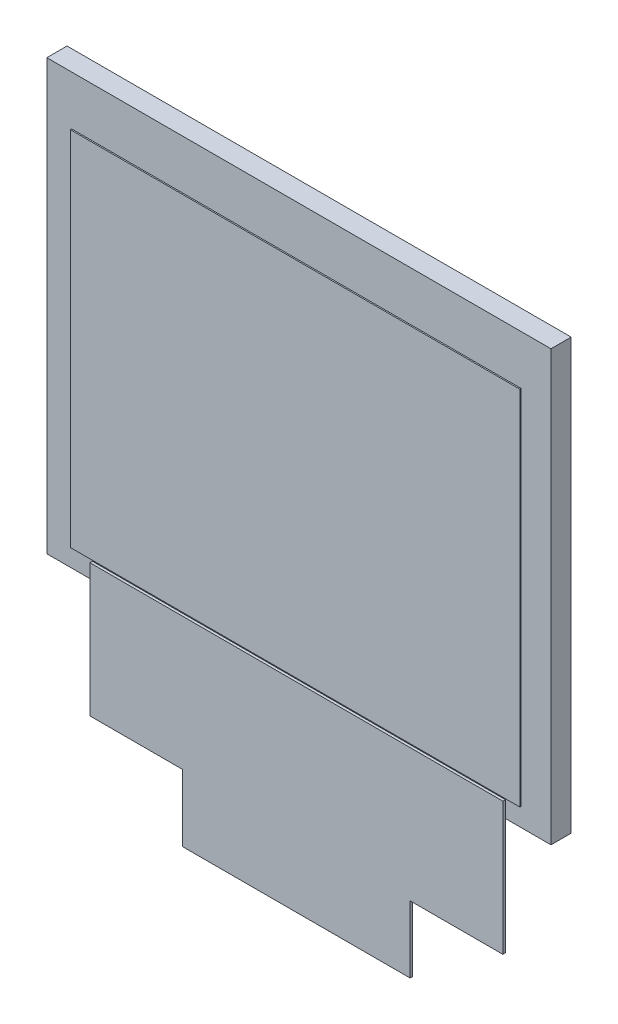
ISO-10303-21;
HEADER;
FILE_DESCRIPTION(('STEP AP214'),'2;1');
FILE_NAME('part.step','',(''),(''),'','','');
FILE_SCHEMA(('AUTOMOTIVE_DESIGN { 1 0 10303 214 1 1 1 1 }'));
ENDSEC;
DATA;
#1=APPLICATION_CONTEXT('core data for automotive mechanical design processes');
#2=APPLICATION_PROTOCOL_DEFINITION('international standard','automotive_design',2000,#1);
#3=PRODUCT_CONTEXT('',#1,'mechanical');
#4=PRODUCT('Part','Part','',(#3));
#5=PRODUCT_RELATED_PRODUCT_CATEGORY('part','',(#4));
#6=PRODUCT_DEFINITION_FORMATION('','',#4);
#7=PRODUCT_DEFINITION_CONTEXT('part definition',#1,'design');
#8=PRODUCT_DEFINITION('design','',#6,#7);
#9=PRODUCT_DEFINITION_SHAPE('','',#8);
#10=(LENGTH_UNIT() NAMED_UNIT(*) SI_UNIT(.MILLI.,.METRE.));
#11=(NAMED_UNIT(*) PLANE_ANGLE_UNIT() SI_UNIT($,.RADIAN.));
#12=(NAMED_UNIT(*) SI_UNIT($,.STERADIAN.) SOLID_ANGLE_UNIT());
#13=UNCERTAINTY_MEASURE_WITH_UNIT(LENGTH_MEASURE(1.E-05),#10,'distance_accuracy_value','');
#14=(GEOMETRIC_REPRESENTATION_CONTEXT(3) GLOBAL_UNCERTAINTY_ASSIGNED_CONTEXT((#13)) GLOBAL_UNIT_ASSIGNED_CONTEXT((#10,
#11,#12)) REPRESENTATION_CONTEXT('',''));
#15=CARTESIAN_POINT('',(0.,0.,0.));
#16=DIRECTION('',(0.,0.,1.));
#17=DIRECTION('',(1.,0.,0.));
#18=AXIS2_PLACEMENT_3D('',#15,#16,#17);
#19=CARTESIAN_POINT('',(-17.7875,13.3,1.9));
#20=DIRECTION('',(1.,0.,0.));
#21=DIRECTION('',(0.,1.,0.));
#22=AXIS2_PLACEMENT_3D('',#19,#20,#21);
#23=PLANE('',#22);
#24=DIRECTION('',(0.,-1.,0.));
#25=VECTOR('',#24,1.);
#26=CARTESIAN_POINT('',(-17.7875,13.3,1.8));
#27=LINE('',#26,#25);
#28=CARTESIAN_POINT('',(-17.7875,13.3,1.8));
#29=VERTEX_POINT('',#28);
#30=CARTESIAN_POINT('',(-17.7875,-15.34,1.8));
#31=VERTEX_POINT('',#30);
#32=EDGE_CURVE('E107',#29,#31,#27,.T.);
#33=ORIENTED_EDGE('',*,*,#32,.T.);
#34=DIRECTION('',(0.,0.,-1.));
#35=VECTOR('',#34,1.);
#36=CARTESIAN_POINT('',(-17.7875,-15.34,1.9));
#37=LINE('',#36,#35);
#38=CARTESIAN_POINT('',(-17.7875,-15.34,1.9));
#39=VERTEX_POINT('',#38);
#40=EDGE_CURVE('E12',#39,#31,#37,.T.);
#41=ORIENTED_EDGE('',*,*,#40,.F.);
#42=DIRECTION('',(0.,-1.,0.));
#43=VECTOR('',#42,1.);
#44=CARTESIAN_POINT('',(-17.7875,13.3,1.9));
#45=LINE('',#44,#43);
#46=CARTESIAN_POINT('',(-17.7875,13.3,1.9));
#47=VERTEX_POINT('',#46);
#48=EDGE_CURVE('E95',#47,#39,#45,.T.);
#49=ORIENTED_EDGE('',*,*,#48,.F.);
#50=DIRECTION('',(0.,0.,-1.));
#51=VECTOR('',#50,1.);
#52=CARTESIAN_POINT('',(-17.7875,13.3,1.9));
#53=LINE('',#52,#51);
#54=EDGE_CURVE('E103',#47,#29,#53,.T.);
#55=ORIENTED_EDGE('',*,*,#54,.T.);
#56=EDGE_LOOP('',(#33,#41,#49,#55));
#57=FACE_BOUND('',#56,.T.);
#58=ADVANCED_FACE('F44',(#57),#23,.F.);
#59=CARTESIAN_POINT('',(-17.7875,-15.34,1.9));
#60=DIRECTION('',(0.,1.,0.));
#61=DIRECTION('',(-1.,0.,0.));
#62=AXIS2_PLACEMENT_3D('',#59,#60,#61);
#63=PLANE('',#62);
#64=DIRECTION('',(1.,0.,0.));
#65=VECTOR('',#64,1.);
#66=CARTESIAN_POINT('',(-17.7875,-15.34,1.8));
#67=LINE('',#66,#65);
#68=CARTESIAN_POINT('',(17.7875,-15.34,1.8));
#69=VERTEX_POINT('',#68);
#70=EDGE_CURVE('E99',#31,#69,#67,.T.);
#71=ORIENTED_EDGE('',*,*,#70,.T.);
#72=DIRECTION('',(0.,0.,-1.));
#73=VECTOR('',#72,1.);
#74=CARTESIAN_POINT('',(17.7875,-15.34,1.9));
#75=LINE('',#74,#73);
#76=CARTESIAN_POINT('',(17.7875,-15.34,1.9));
#77=VERTEX_POINT('',#76);
#78=EDGE_CURVE('E52',#77,#69,#75,.T.);
#79=ORIENTED_EDGE('',*,*,#78,.F.);
#80=DIRECTION('',(1.,0.,0.));
#81=VECTOR('',#80,1.);
#82=CARTESIAN_POINT('',(-17.7875,-15.34,1.9));
#83=LINE('',#82,#81);
#84=EDGE_CURVE('E90',#39,#77,#83,.T.);
#85=ORIENTED_EDGE('',*,*,#84,.F.);
#86=ORIENTED_EDGE('',*,*,#40,.T.);
#87=EDGE_LOOP('',(#71,#79,#85,#86));
#88=FACE_BOUND('',#87,.T.);
#89=ADVANCED_FACE('F98',(#88),#63,.F.);
#90=CARTESIAN_POINT('',(17.7875,13.3,1.9));
#91=DIRECTION('',(-1.,0.,0.));
#92=DIRECTION('',(0.,-1.,0.));
#93=AXIS2_PLACEMENT_3D('',#90,#91,#92);
#94=PLANE('',#93);
#95=DIRECTION('',(0.,1.,0.));
#96=VECTOR('',#95,1.);
#97=CARTESIAN_POINT('',(17.7875,13.3,1.8));
#98=LINE('',#97,#96);
#99=CARTESIAN_POINT('',(17.7875,13.3,1.8));
#100=VERTEX_POINT('',#99);
#101=EDGE_CURVE('E77',#69,#100,#98,.T.);
#102=ORIENTED_EDGE('',*,*,#101,.T.);
#103=DIRECTION('',(0.,0.,-1.));
#104=VECTOR('',#103,1.);
#105=CARTESIAN_POINT('',(17.7875,13.3,1.9));
#106=LINE('',#105,#104);
#107=CARTESIAN_POINT('',(17.7875,13.3,1.9));
#108=VERTEX_POINT('',#107);
#109=EDGE_CURVE('E100',#108,#100,#106,.T.);
#110=ORIENTED_EDGE('',*,*,#109,.F.);
#111=DIRECTION('',(0.,1.,0.));
#112=VECTOR('',#111,1.);
#113=CARTESIAN_POINT('',(17.7875,13.3,1.9));
#114=LINE('',#113,#112);
#115=EDGE_CURVE('E93',#77,#108,#114,.T.);
#116=ORIENTED_EDGE('',*,*,#115,.F.);
#117=ORIENTED_EDGE('',*,*,#78,.T.);
#118=EDGE_LOOP('',(#102,#110,#116,#117));
#119=FACE_BOUND('',#118,.T.);
#120=ADVANCED_FACE('F101',(#119),#94,.F.);
#121=CARTESIAN_POINT('',(-17.7875,13.3,1.9));
#122=DIRECTION('',(0.,-1.,0.));
#123=DIRECTION('',(1.,0.,0.));
#124=AXIS2_PLACEMENT_3D('',#121,#122,#123);
#125=PLANE('',#124);
#126=DIRECTION('',(-1.,0.,0.));
#127=VECTOR('',#126,1.);
#128=CARTESIAN_POINT('',(-17.7875,13.3,1.8));
#129=LINE('',#128,#127);
#130=EDGE_CURVE('E83',#100,#29,#129,.T.);
#131=ORIENTED_EDGE('',*,*,#130,.T.);
#132=ORIENTED_EDGE('',*,*,#54,.F.);
#133=DIRECTION('',(-1.,0.,0.));
#134=VECTOR('',#133,1.);
#135=CARTESIAN_POINT('',(-17.7875,13.3,1.9));
#136=LINE('',#135,#134);
#137=EDGE_CURVE('E60',#108,#47,#136,.T.);
#138=ORIENTED_EDGE('',*,*,#137,.F.);
#139=ORIENTED_EDGE('',*,*,#109,.T.);
#140=EDGE_LOOP('',(#131,#132,#138,#139));
#141=FACE_BOUND('',#140,.T.);
#142=ADVANCED_FACE('F114',(#141),#125,.F.);
#143=CARTESIAN_POINT('',(0.,0.,1.9));
#144=DIRECTION('',(0.,0.,1.));
#145=DIRECTION('',(1.,0.,0.));
#146=AXIS2_PLACEMENT_3D('',#143,#144,#145);
#147=PLANE('',#146);
#148=ORIENTED_EDGE('',*,*,#48,.T.);
#149=ORIENTED_EDGE('',*,*,#84,.T.);
#150=ORIENTED_EDGE('',*,*,#115,.T.);
#151=ORIENTED_EDGE('',*,*,#137,.T.);
#152=EDGE_LOOP('',(#148,#149,#150,#151));
#153=FACE_BOUND('',#152,.T.);
#154=ADVANCED_FACE('F91',(#153),#147,.T.);
#155=CARTESIAN_POINT('',(0.,0.,1.8));
#156=DIRECTION('',(0.,0.,1.));
#157=DIRECTION('',(1.,0.,0.));
#158=AXIS2_PLACEMENT_3D('',#155,#156,#157);
#159=PLANE('',#158);
#160=ORIENTED_EDGE('',*,*,#32,.F.);
#161=ORIENTED_EDGE('',*,*,#130,.F.);
#162=ORIENTED_EDGE('',*,*,#101,.F.);
#163=ORIENTED_EDGE('',*,*,#70,.F.);
#164=EDGE_LOOP('',(#160,#161,#162,#163));
#165=FACE_BOUND('',#164,.T.);
#166=ADVANCED_FACE('F117',(#165),#159,.F.);
#167=CLOSED_SHELL('',(#58,#89,#120,#142,#154,#166));
#168=MANIFOLD_SOLID_BREP('B2',#167);
#169=CARTESIAN_POINT('',(-19.95,17.,1.6));
#170=DIRECTION('',(1.,0.,0.));
#171=DIRECTION('',(0.,1.,0.));
#172=AXIS2_PLACEMENT_3D('',#169,#170,#171);
#173=PLANE('',#172);
#174=DIRECTION('',(0.,-1.,0.));
#175=VECTOR('',#174,1.);
#176=CARTESIAN_POINT('',(-19.95,17.,0.));
#177=LINE('',#176,#175);
#178=CARTESIAN_POINT('',(-19.95,17.,0.));
#179=VERTEX_POINT('',#178);
#180=CARTESIAN_POINT('',(-19.95,-17.,0.));
#181=VERTEX_POINT('',#180);
#182=EDGE_CURVE('E286',#179,#181,#177,.T.);
#183=ORIENTED_EDGE('',*,*,#182,.T.);
#184=DIRECTION('',(0.,0.,-1.));
#185=VECTOR('',#184,1.);
#186=CARTESIAN_POINT('',(-19.95,-17.,1.6));
#187=LINE('',#186,#185);
#188=CARTESIAN_POINT('',(-19.95,-17.,1.6));
#189=VERTEX_POINT('',#188);
#190=EDGE_CURVE('E170',#189,#181,#187,.T.);
#191=ORIENTED_EDGE('',*,*,#190,.F.);
#192=DIRECTION('',(0.,-1.,0.));
#193=VECTOR('',#192,1.);
#194=CARTESIAN_POINT('',(-19.95,17.,1.6));
#195=LINE('',#194,#193);
#196=CARTESIAN_POINT('',(-19.95,17.,1.6));
#197=VERTEX_POINT('',#196);
#198=EDGE_CURVE('E295',#197,#189,#195,.T.);
#199=ORIENTED_EDGE('',*,*,#198,.F.);
#200=DIRECTION('',(0.,0.,-1.));
#201=VECTOR('',#200,1.);
#202=CARTESIAN_POINT('',(-19.95,17.,1.6));
#203=LINE('',#202,#201);
#204=EDGE_CURVE('E306',#197,#179,#203,.T.);
#205=ORIENTED_EDGE('',*,*,#204,.T.);
#206=EDGE_LOOP('',(#183,#191,#199,#205));
#207=FACE_BOUND('',#206,.T.);
#208=ADVANCED_FACE('F167',(#207),#173,.F.);
#209=CARTESIAN_POINT('',(-19.95,-17.,1.6));
#210=DIRECTION('',(0.,1.,0.));
#211=DIRECTION('',(0.,0.,1.));
#212=AXIS2_PLACEMENT_3D('',#209,#210,#211);
#213=PLANE('',#212);
#214=DIRECTION('',(1.,0.,0.));
#215=VECTOR('',#214,1.);
#216=CARTESIAN_POINT('',(-19.95,-17.,0.));
#217=LINE('',#216,#215);
#218=CARTESIAN_POINT('',(19.95,-17.,0.));
#219=VERTEX_POINT('',#218);
#220=EDGE_CURVE('E289',#181,#219,#217,.T.);
#221=ORIENTED_EDGE('',*,*,#220,.T.);
#222=DIRECTION('',(0.,0.,-1.));
#223=VECTOR('',#222,1.);
#224=CARTESIAN_POINT('',(19.95,-17.,1.6));
#225=LINE('',#224,#223);
#226=CARTESIAN_POINT('',(19.95,-17.,1.6));
#227=VERTEX_POINT('',#226);
#228=EDGE_CURVE('E316',#227,#219,#225,.T.);
#229=ORIENTED_EDGE('',*,*,#228,.F.);
#230=DIRECTION('',(1.,0.,0.));
#231=VECTOR('',#230,1.);
#232=CARTESIAN_POINT('',(-19.95,-17.,1.6));
#233=LINE('',#232,#231);
#234=CARTESIAN_POINT('',(16.34,-17.,1.6));
#235=VERTEX_POINT('',#234);
#236=EDGE_CURVE('E298',#235,#227,#233,.T.);
#237=ORIENTED_EDGE('',*,*,#236,.F.);
#238=CARTESIAN_POINT('',(-16.34,-17.,1.6));
#239=VERTEX_POINT('',#238);
#240=EDGE_CURVE('E303',#239,#235,#233,.T.);
#241=ORIENTED_EDGE('',*,*,#240,.F.);
#242=EDGE_CURVE('E300',#189,#239,#233,.T.);
#243=ORIENTED_EDGE('',*,*,#242,.F.);
#244=ORIENTED_EDGE('',*,*,#190,.T.);
#245=EDGE_LOOP('',(#221,#229,#237,#241,#243,#244));
#246=FACE_BOUND('',#245,.T.);
#247=ADVANCED_FACE('F325',(#246),#213,.F.);
#248=CARTESIAN_POINT('',(19.95,17.,1.6));
#249=DIRECTION('',(-1.,0.,0.));
#250=DIRECTION('',(0.,-1.,0.));
#251=AXIS2_PLACEMENT_3D('',#248,#249,#250);
#252=PLANE('',#251);
#253=DIRECTION('',(0.,1.,0.));
#254=VECTOR('',#253,1.);
#255=CARTESIAN_POINT('',(19.95,17.,0.));
#256=LINE('',#255,#254);
#257=CARTESIAN_POINT('',(19.95,17.,0.));
#258=VERTEX_POINT('',#257);
#259=EDGE_CURVE('E309',#219,#258,#256,.T.);
#260=ORIENTED_EDGE('',*,*,#259,.T.);
#261=DIRECTION('',(0.,0.,-1.));
#262=VECTOR('',#261,1.);
#263=CARTESIAN_POINT('',(19.95,17.,1.6));
#264=LINE('',#263,#262);
#265=CARTESIAN_POINT('',(19.95,17.,1.6));
#266=VERTEX_POINT('',#265);
#267=EDGE_CURVE('E314',#266,#258,#264,.T.);
#268=ORIENTED_EDGE('',*,*,#267,.F.);
#269=DIRECTION('',(0.,1.,0.));
#270=VECTOR('',#269,1.);
#271=CARTESIAN_POINT('',(19.95,17.,1.6));
#272=LINE('',#271,#270);
#273=EDGE_CURVE('E302',#227,#266,#272,.T.);
#274=ORIENTED_EDGE('',*,*,#273,.F.);
#275=ORIENTED_EDGE('',*,*,#228,.T.);
#276=EDGE_LOOP('',(#260,#268,#274,#275));
#277=FACE_BOUND('',#276,.T.);
#278=ADVANCED_FACE('F334',(#277),#252,.F.);
#279=CARTESIAN_POINT('',(-19.95,17.,1.6));
#280=DIRECTION('',(0.,-1.,0.));
#281=DIRECTION('',(0.,0.,-1.));
#282=AXIS2_PLACEMENT_3D('',#279,#280,#281);
#283=PLANE('',#282);
#284=DIRECTION('',(-1.,0.,0.));
#285=VECTOR('',#284,1.);
#286=CARTESIAN_POINT('',(-19.95,17.,0.));
#287=LINE('',#286,#285);
#288=EDGE_CURVE('E299',#258,#179,#287,.T.);
#289=ORIENTED_EDGE('',*,*,#288,.T.);
#290=ORIENTED_EDGE('',*,*,#204,.F.);
#291=DIRECTION('',(-1.,0.,0.));
#292=VECTOR('',#291,1.);
#293=CARTESIAN_POINT('',(-19.95,17.,1.6));
#294=LINE('',#293,#292);
#295=EDGE_CURVE('E305',#266,#197,#294,.T.);
#296=ORIENTED_EDGE('',*,*,#295,.F.);
#297=ORIENTED_EDGE('',*,*,#267,.T.);
#298=EDGE_LOOP('',(#289,#290,#296,#297));
#299=FACE_BOUND('',#298,.T.);
#300=ADVANCED_FACE('F337',(#299),#283,.F.);
#301=CARTESIAN_POINT('',(0.,0.,1.6));
#302=DIRECTION('',(0.,0.,1.));
#303=DIRECTION('',(1.,0.,0.));
#304=AXIS2_PLACEMENT_3D('',#301,#302,#303);
#305=PLANE('',#304);
#306=DIRECTION('',(0.,-1.,0.));
#307=VECTOR('',#306,1.);
#308=CARTESIAN_POINT('',(-16.34,-15.7079062646832,1.6));
#309=LINE('',#308,#307);
#310=CARTESIAN_POINT('',(-16.34,-15.7079062646832,1.6));
#311=VERTEX_POINT('',#310);
#312=EDGE_CURVE('E183',#311,#239,#309,.T.);
#313=ORIENTED_EDGE('',*,*,#312,.F.);
#314=DIRECTION('',(-1.,0.,0.));
#315=VECTOR('',#314,1.);
#316=CARTESIAN_POINT('',(-16.34,-15.7079062646832,1.6));
#317=LINE('',#316,#315);
#318=CARTESIAN_POINT('',(16.34,-15.7079062646832,1.6));
#319=VERTEX_POINT('',#318);
#320=EDGE_CURVE('E280',#319,#311,#317,.T.);
#321=ORIENTED_EDGE('',*,*,#320,.F.);
#322=DIRECTION('',(0.,1.,0.));
#323=VECTOR('',#322,1.);
#324=CARTESIAN_POINT('',(16.34,-15.7079062646832,1.6));
#325=LINE('',#324,#323);
#326=EDGE_CURVE('E42',#235,#319,#325,.T.);
#327=ORIENTED_EDGE('',*,*,#326,.F.);
#328=ORIENTED_EDGE('',*,*,#236,.T.);
#329=ORIENTED_EDGE('',*,*,#273,.T.);
#330=ORIENTED_EDGE('',*,*,#295,.T.);
#331=ORIENTED_EDGE('',*,*,#198,.T.);
#332=ORIENTED_EDGE('',*,*,#242,.T.);
#333=EDGE_LOOP('',(#313,#321,#327,#328,#329,#330,#331,#332));
#334=FACE_BOUND('',#333,.T.);
#335=ADVANCED_FACE('F338',(#334),#305,.T.);
#336=CARTESIAN_POINT('',(0.,0.,0.));
#337=DIRECTION('',(0.,0.,1.));
#338=DIRECTION('',(1.,0.,0.));
#339=AXIS2_PLACEMENT_3D('',#336,#337,#338);
#340=PLANE('',#339);
#341=ORIENTED_EDGE('',*,*,#182,.F.);
#342=ORIENTED_EDGE('',*,*,#288,.F.);
#343=ORIENTED_EDGE('',*,*,#259,.F.);
#344=ORIENTED_EDGE('',*,*,#220,.F.);
#345=EDGE_LOOP('',(#341,#342,#343,#344));
#346=FACE_BOUND('',#345,.T.);
#347=ADVANCED_FACE('F332',(#346),#340,.F.);
#348=CARTESIAN_POINT('',(0.,0.,1.6));
#349=DIRECTION('',(0.,0.,1.));
#350=DIRECTION('',(1.,0.,0.));
#351=AXIS2_PLACEMENT_3D('',#348,#349,#350);
#352=PLANE('',#351);
#353=CARTESIAN_POINT('',(-16.34,-26.2079062646832,1.6));
#354=VERTEX_POINT('',#353);
#355=EDGE_CURVE('E284',#239,#354,#309,.T.);
#356=ORIENTED_EDGE('',*,*,#355,.F.);
#357=ORIENTED_EDGE('',*,*,#240,.T.);
#358=CARTESIAN_POINT('',(16.34,-26.2079062646832,1.6));
#359=VERTEX_POINT('',#358);
#360=EDGE_CURVE('E176',#359,#235,#325,.T.);
#361=ORIENTED_EDGE('',*,*,#360,.F.);
#362=DIRECTION('',(1.,0.,0.));
#363=VECTOR('',#362,1.);
#364=CARTESIAN_POINT('',(9.00000000000001,-26.2079062646832,1.6));
#365=LINE('',#364,#363);
#366=CARTESIAN_POINT('',(9.00000000000001,-26.2079062646832,1.6));
#367=VERTEX_POINT('',#366);
#368=EDGE_CURVE('E353',#367,#359,#365,.T.);
#369=ORIENTED_EDGE('',*,*,#368,.F.);
#370=DIRECTION('',(0.,1.,0.));
#371=VECTOR('',#370,1.);
#372=CARTESIAN_POINT('',(9.00000000000001,-31.5,1.6));
#373=LINE('',#372,#371);
#374=CARTESIAN_POINT('',(9.00000000000001,-31.5,1.6));
#375=VERTEX_POINT('',#374);
#376=EDGE_CURVE('E355',#375,#367,#373,.T.);
#377=ORIENTED_EDGE('',*,*,#376,.F.);
#378=DIRECTION('',(1.,0.,0.));
#379=VECTOR('',#378,1.);
#380=CARTESIAN_POINT('',(-8.99999999999999,-31.5,1.6));
#381=LINE('',#380,#379);
#382=CARTESIAN_POINT('',(-8.99999999999999,-31.5,1.6));
#383=VERTEX_POINT('',#382);
#384=EDGE_CURVE('E376',#383,#375,#381,.T.);
#385=ORIENTED_EDGE('',*,*,#384,.F.);
#386=DIRECTION('',(0.,-1.,0.));
#387=VECTOR('',#386,1.);
#388=CARTESIAN_POINT('',(-8.99999999999999,-26.2079062646832,1.6));
#389=LINE('',#388,#387);
#390=CARTESIAN_POINT('',(-8.99999999999999,-26.2079062646832,1.6));
#391=VERTEX_POINT('',#390);
#392=EDGE_CURVE('E381',#391,#383,#389,.T.);
#393=ORIENTED_EDGE('',*,*,#392,.F.);
#394=DIRECTION('',(1.,0.,0.));
#395=VECTOR('',#394,1.);
#396=CARTESIAN_POINT('',(-16.34,-26.2079062646832,1.6));
#397=LINE('',#396,#395);
#398=EDGE_CURVE('E383',#354,#391,#397,.T.);
#399=ORIENTED_EDGE('',*,*,#398,.F.);
#400=EDGE_LOOP('',(#356,#357,#361,#369,#377,#385,#393,#399));
#401=FACE_BOUND('',#400,.T.);
#402=ADVANCED_FACE('F343',(#401),#352,.F.);
#403=CARTESIAN_POINT('',(-16.34,-15.7079062646832,1.8));
#404=DIRECTION('',(1.,0.,0.));
#405=DIRECTION('',(0.,0.,-1.));
#406=AXIS2_PLACEMENT_3D('',#403,#404,#405);
#407=PLANE('',#406);
#408=ORIENTED_EDGE('',*,*,#312,.T.);
#409=ORIENTED_EDGE('',*,*,#355,.T.);
#410=DIRECTION('',(0.,0.,-1.));
#411=VECTOR('',#410,1.);
#412=CARTESIAN_POINT('',(-16.34,-26.2079062646832,1.8));
#413=LINE('',#412,#411);
#414=CARTESIAN_POINT('',(-16.34,-26.2079062646832,1.8));
#415=VERTEX_POINT('',#414);
#416=EDGE_CURVE('E265',#415,#354,#413,.T.);
#417=ORIENTED_EDGE('',*,*,#416,.F.);
#418=DIRECTION('',(0.,-1.,0.));
#419=VECTOR('',#418,1.);
#420=CARTESIAN_POINT('',(-16.34,-15.7079062646832,1.8));
#421=LINE('',#420,#419);
#422=CARTESIAN_POINT('',(-16.34,-15.7079062646832,1.8));
#423=VERTEX_POINT('',#422);
#424=EDGE_CURVE('E271',#423,#415,#421,.T.);
#425=ORIENTED_EDGE('',*,*,#424,.F.);
#426=DIRECTION('',(0.,0.,-1.));
#427=VECTOR('',#426,1.);
#428=CARTESIAN_POINT('',(-16.34,-15.7079062646832,1.8));
#429=LINE('',#428,#427);
#430=EDGE_CURVE('E359',#423,#311,#429,.T.);
#431=ORIENTED_EDGE('',*,*,#430,.T.);
#432=EDGE_LOOP('',(#408,#409,#417,#425,#431));
#433=FACE_BOUND('',#432,.T.);
#434=ADVANCED_FACE('F282',(#433),#407,.F.);
#435=CARTESIAN_POINT('',(-16.34,-26.2079062646832,1.8));
#436=DIRECTION('',(0.,1.,0.));
#437=DIRECTION('',(0.,0.,1.));
#438=AXIS2_PLACEMENT_3D('',#435,#436,#437);
#439=PLANE('',#438);
#440=ORIENTED_EDGE('',*,*,#398,.T.);
#441=DIRECTION('',(0.,0.,-1.));
#442=VECTOR('',#441,1.);
#443=CARTESIAN_POINT('',(-8.99999999999999,-26.2079062646832,1.8));
#444=LINE('',#443,#442);
#445=CARTESIAN_POINT('',(-8.99999999999999,-26.2079062646832,1.8));
#446=VERTEX_POINT('',#445);
#447=EDGE_CURVE('E267',#446,#391,#444,.T.);
#448=ORIENTED_EDGE('',*,*,#447,.F.);
#449=DIRECTION('',(1.,0.,0.));
#450=VECTOR('',#449,1.);
#451=CARTESIAN_POINT('',(-16.34,-26.2079062646832,1.8));
#452=LINE('',#451,#450);
#453=EDGE_CURVE('E261',#415,#446,#452,.T.);
#454=ORIENTED_EDGE('',*,*,#453,.F.);
#455=ORIENTED_EDGE('',*,*,#416,.T.);
#456=EDGE_LOOP('',(#440,#448,#454,#455));
#457=FACE_BOUND('',#456,.T.);
#458=ADVANCED_FACE('F263',(#457),#439,.F.);
#459=CARTESIAN_POINT('',(-8.99999999999999,-26.2079062646832,1.8));
#460=DIRECTION('',(1.,0.,0.));
#461=DIRECTION('',(0.,0.,-1.));
#462=AXIS2_PLACEMENT_3D('',#459,#460,#461);
#463=PLANE('',#462);
#464=ORIENTED_EDGE('',*,*,#392,.T.);
#465=DIRECTION('',(0.,0.,-1.));
#466=VECTOR('',#465,1.);
#467=CARTESIAN_POINT('',(-8.99999999999999,-31.5,1.8));
#468=LINE('',#467,#466);
#469=CARTESIAN_POINT('',(-8.99999999999999,-31.5,1.8));
#470=VERTEX_POINT('',#469);
#471=EDGE_CURVE('E291',#470,#383,#468,.T.);
#472=ORIENTED_EDGE('',*,*,#471,.F.);
#473=DIRECTION('',(0.,-1.,0.));
#474=VECTOR('',#473,1.);
#475=CARTESIAN_POINT('',(-8.99999999999999,-26.2079062646832,1.8));
#476=LINE('',#475,#474);
#477=EDGE_CURVE('E270',#446,#470,#476,.T.);
#478=ORIENTED_EDGE('',*,*,#477,.F.);
#479=ORIENTED_EDGE('',*,*,#447,.T.);
#480=EDGE_LOOP('',(#464,#472,#478,#479));
#481=FACE_BOUND('',#480,.T.);
#482=ADVANCED_FACE('F396',(#481),#463,.F.);
#483=CARTESIAN_POINT('',(-8.99999999999999,-31.5,1.8));
#484=DIRECTION('',(0.,1.,0.));
#485=DIRECTION('',(0.,0.,1.));
#486=AXIS2_PLACEMENT_3D('',#483,#484,#485);
#487=PLANE('',#486);
#488=ORIENTED_EDGE('',*,*,#384,.T.);
#489=DIRECTION('',(0.,0.,-1.));
#490=VECTOR('',#489,1.);
#491=CARTESIAN_POINT('',(9.00000000000001,-31.5,1.8));
#492=LINE('',#491,#490);
#493=CARTESIAN_POINT('',(9.00000000000001,-31.5,1.8));
#494=VERTEX_POINT('',#493);
#495=EDGE_CURVE('E367',#494,#375,#492,.T.);
#496=ORIENTED_EDGE('',*,*,#495,.F.);
#497=DIRECTION('',(1.,0.,0.));
#498=VECTOR('',#497,1.);
#499=CARTESIAN_POINT('',(-8.99999999999999,-31.5,1.8));
#500=LINE('',#499,#498);
#501=EDGE_CURVE('E377',#470,#494,#500,.T.);
#502=ORIENTED_EDGE('',*,*,#501,.F.);
#503=ORIENTED_EDGE('',*,*,#471,.T.);
#504=EDGE_LOOP('',(#488,#496,#502,#503));
#505=FACE_BOUND('',#504,.T.);
#506=ADVANCED_FACE('F374',(#505),#487,.F.);
#507=CARTESIAN_POINT('',(9.00000000000001,-31.5,1.8));
#508=DIRECTION('',(-1.,0.,0.));
#509=DIRECTION('',(0.,0.,1.));
#510=AXIS2_PLACEMENT_3D('',#507,#508,#509);
#511=PLANE('',#510);
#512=ORIENTED_EDGE('',*,*,#376,.T.);
#513=DIRECTION('',(0.,0.,-1.));
#514=VECTOR('',#513,1.);
#515=CARTESIAN_POINT('',(9.00000000000001,-26.2079062646832,1.8));
#516=LINE('',#515,#514);
#517=CARTESIAN_POINT('',(9.00000000000001,-26.2079062646832,1.8));
#518=VERTEX_POINT('',#517);
#519=EDGE_CURVE('E364',#518,#367,#516,.T.);
#520=ORIENTED_EDGE('',*,*,#519,.F.);
#521=DIRECTION('',(0.,1.,0.));
#522=VECTOR('',#521,1.);
#523=CARTESIAN_POINT('',(9.00000000000001,-31.5,1.8));
#524=LINE('',#523,#522);
#525=EDGE_CURVE('E393',#494,#518,#524,.T.);
#526=ORIENTED_EDGE('',*,*,#525,.F.);
#527=ORIENTED_EDGE('',*,*,#495,.T.);
#528=EDGE_LOOP('',(#512,#520,#526,#527));
#529=FACE_BOUND('',#528,.T.);
#530=ADVANCED_FACE('F403',(#529),#511,.F.);
#531=CARTESIAN_POINT('',(9.00000000000001,-26.2079062646832,1.8));
#532=DIRECTION('',(0.,1.,0.));
#533=DIRECTION('',(0.,0.,1.));
#534=AXIS2_PLACEMENT_3D('',#531,#532,#533);
#535=PLANE('',#534);
#536=ORIENTED_EDGE('',*,*,#368,.T.);
#537=DIRECTION('',(0.,0.,-1.));
#538=VECTOR('',#537,1.);
#539=CARTESIAN_POINT('',(16.34,-26.2079062646832,1.8));
#540=LINE('',#539,#538);
#541=CARTESIAN_POINT('',(16.34,-26.2079062646832,1.8));
#542=VERTEX_POINT('',#541);
#543=EDGE_CURVE('E352',#542,#359,#540,.T.);
#544=ORIENTED_EDGE('',*,*,#543,.F.);
#545=DIRECTION('',(1.,0.,0.));
#546=VECTOR('',#545,1.);
#547=CARTESIAN_POINT('',(9.00000000000001,-26.2079062646832,1.8));
#548=LINE('',#547,#546);
#549=EDGE_CURVE('E391',#518,#542,#548,.T.);
#550=ORIENTED_EDGE('',*,*,#549,.F.);
#551=ORIENTED_EDGE('',*,*,#519,.T.);
#552=EDGE_LOOP('',(#536,#544,#550,#551));
#553=FACE_BOUND('',#552,.T.);
#554=ADVANCED_FACE('F436',(#553),#535,.F.);
#555=CARTESIAN_POINT('',(16.34,-15.7079062646832,1.8));
#556=DIRECTION('',(-1.,0.,0.));
#557=DIRECTION('',(0.,-1.,0.));
#558=AXIS2_PLACEMENT_3D('',#555,#556,#557);
#559=PLANE('',#558);
#560=ORIENTED_EDGE('',*,*,#360,.T.);
#561=ORIENTED_EDGE('',*,*,#326,.T.);
#562=DIRECTION('',(0.,0.,-1.));
#563=VECTOR('',#562,1.);
#564=CARTESIAN_POINT('',(16.34,-15.7079062646832,1.8));
#565=LINE('',#564,#563);
#566=CARTESIAN_POINT('',(16.34,-15.7079062646832,1.8));
#567=VERTEX_POINT('',#566);
#568=EDGE_CURVE('E361',#567,#319,#565,.T.);
#569=ORIENTED_EDGE('',*,*,#568,.F.);
#570=DIRECTION('',(0.,1.,0.));
#571=VECTOR('',#570,1.);
#572=CARTESIAN_POINT('',(16.34,-15.7079062646832,1.8));
#573=LINE('',#572,#571);
#574=EDGE_CURVE('E389',#542,#567,#573,.T.);
#575=ORIENTED_EDGE('',*,*,#574,.F.);
#576=ORIENTED_EDGE('',*,*,#543,.T.);
#577=EDGE_LOOP('',(#560,#561,#569,#575,#576));
#578=FACE_BOUND('',#577,.T.);
#579=ADVANCED_FACE('F347',(#578),#559,.F.);
#580=CARTESIAN_POINT('',(-16.34,-15.7079062646832,1.8));
#581=DIRECTION('',(0.,-1.,0.));
#582=DIRECTION('',(1.,0.,0.));
#583=AXIS2_PLACEMENT_3D('',#580,#581,#582);
#584=PLANE('',#583);
#585=ORIENTED_EDGE('',*,*,#320,.T.);
#586=ORIENTED_EDGE('',*,*,#430,.F.);
#587=DIRECTION('',(-1.,0.,0.));
#588=VECTOR('',#587,1.);
#589=CARTESIAN_POINT('',(-16.34,-15.7079062646832,1.8));
#590=LINE('',#589,#588);
#591=EDGE_CURVE('E276',#567,#423,#590,.T.);
#592=ORIENTED_EDGE('',*,*,#591,.F.);
#593=ORIENTED_EDGE('',*,*,#568,.T.);
#594=EDGE_LOOP('',(#585,#586,#592,#593));
#595=FACE_BOUND('',#594,.T.);
#596=ADVANCED_FACE('F430',(#595),#584,.F.);
#597=CARTESIAN_POINT('',(0.,0.,1.8));
#598=DIRECTION('',(0.,0.,1.));
#599=DIRECTION('',(1.,0.,0.));
#600=AXIS2_PLACEMENT_3D('',#597,#598,#599);
#601=PLANE('',#600);
#602=ORIENTED_EDGE('',*,*,#424,.T.);
#603=ORIENTED_EDGE('',*,*,#453,.T.);
#604=ORIENTED_EDGE('',*,*,#477,.T.);
#605=ORIENTED_EDGE('',*,*,#501,.T.);
#606=ORIENTED_EDGE('',*,*,#525,.T.);
#607=ORIENTED_EDGE('',*,*,#549,.T.);
#608=ORIENTED_EDGE('',*,*,#574,.T.);
#609=ORIENTED_EDGE('',*,*,#591,.T.);
#610=EDGE_LOOP('',(#602,#603,#604,#605,#606,#607,#608,#609));
#611=FACE_BOUND('',#610,.T.);
#612=ADVANCED_FACE('F274',(#611),#601,.T.);
#613=CLOSED_SHELL('',(#208,#247,#278,#300,#335,#347,#402,#434,#458,#482,#506,#530,#554,#579,
#596,#612));
#614=MANIFOLD_SOLID_BREP('B6',#613);
#615=ADVANCED_BREP_SHAPE_REPRESENTATION('',(#18,#168,#614),#14);
#616=SHAPE_DEFINITION_REPRESENTATION(#9,#615);
ENDSEC;
END-ISO-10303-21;
